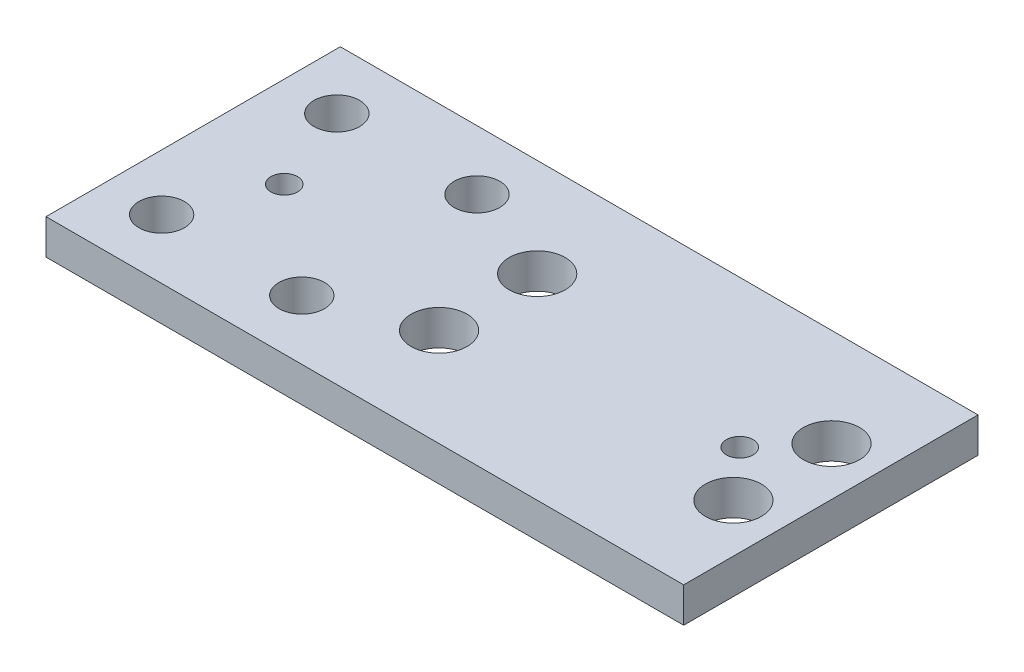
ISO-10303-21;
HEADER;
FILE_DESCRIPTION(('STEP AP214'),'2;1');
FILE_NAME('part.step','',(''),(''),'','','');
FILE_SCHEMA(('AUTOMOTIVE_DESIGN { 1 0 10303 214 1 1 1 1 }'));
ENDSEC;
DATA;
#1=APPLICATION_CONTEXT('core data for automotive mechanical design processes');
#2=APPLICATION_PROTOCOL_DEFINITION('international standard','automotive_design',2000,#1);
#3=PRODUCT_CONTEXT('',#1,'mechanical');
#4=PRODUCT('Part','Part','',(#3));
#5=PRODUCT_RELATED_PRODUCT_CATEGORY('part','',(#4));
#6=PRODUCT_DEFINITION_FORMATION('','',#4);
#7=PRODUCT_DEFINITION_CONTEXT('part definition',#1,'design');
#8=PRODUCT_DEFINITION('design','',#6,#7);
#9=PRODUCT_DEFINITION_SHAPE('','',#8);
#10=(LENGTH_UNIT() NAMED_UNIT(*) SI_UNIT(.MILLI.,.METRE.));
#11=(NAMED_UNIT(*) PLANE_ANGLE_UNIT() SI_UNIT($,.RADIAN.));
#12=(NAMED_UNIT(*) SI_UNIT($,.STERADIAN.) SOLID_ANGLE_UNIT());
#13=UNCERTAINTY_MEASURE_WITH_UNIT(LENGTH_MEASURE(1.E-05),#10,'distance_accuracy_value','');
#14=(GEOMETRIC_REPRESENTATION_CONTEXT(3) GLOBAL_UNCERTAINTY_ASSIGNED_CONTEXT((#13)) GLOBAL_UNIT_ASSIGNED_CONTEXT((#10,
#11,#12)) REPRESENTATION_CONTEXT('',''));
#15=CARTESIAN_POINT('',(0.,0.,0.));
#16=DIRECTION('',(0.,0.,1.));
#17=DIRECTION('',(1.,0.,0.));
#18=AXIS2_PLACEMENT_3D('',#15,#16,#17);
#19=CARTESIAN_POINT('',(0.,5.,0.));
#20=DIRECTION('',(1.,0.,0.));
#21=DIRECTION('',(0.,0.,-1.));
#22=AXIS2_PLACEMENT_3D('',#19,#20,#21);
#23=PLANE('',#22);
#24=DIRECTION('',(0.,0.,1.));
#25=VECTOR('',#24,1.);
#26=CARTESIAN_POINT('',(0.,0.,0.));
#27=LINE('',#26,#25);
#28=CARTESIAN_POINT('',(0.,0.,-42.));
#29=VERTEX_POINT('',#28);
#30=CARTESIAN_POINT('',(0.,0.,0.));
#31=VERTEX_POINT('',#30);
#32=EDGE_CURVE('E97',#29,#31,#27,.T.);
#33=ORIENTED_EDGE('',*,*,#32,.T.);
#34=DIRECTION('',(0.,-1.,0.));
#35=VECTOR('',#34,1.);
#36=CARTESIAN_POINT('',(0.,5.,0.));
#37=LINE('',#36,#35);
#38=CARTESIAN_POINT('',(0.,5.,0.));
#39=VERTEX_POINT('',#38);
#40=EDGE_CURVE('E11',#39,#31,#37,.T.);
#41=ORIENTED_EDGE('',*,*,#40,.F.);
#42=DIRECTION('',(0.,0.,1.));
#43=VECTOR('',#42,1.);
#44=CARTESIAN_POINT('',(0.,5.,0.));
#45=LINE('',#44,#43);
#46=CARTESIAN_POINT('',(0.,5.,-42.));
#47=VERTEX_POINT('',#46);
#48=EDGE_CURVE('E85',#47,#39,#45,.T.);
#49=ORIENTED_EDGE('',*,*,#48,.F.);
#50=DIRECTION('',(0.,-1.,0.));
#51=VECTOR('',#50,1.);
#52=CARTESIAN_POINT('',(0.,5.,-42.));
#53=LINE('',#52,#51);
#54=EDGE_CURVE('E93',#47,#29,#53,.T.);
#55=ORIENTED_EDGE('',*,*,#54,.T.);
#56=EDGE_LOOP('',(#33,#41,#49,#55));
#57=FACE_BOUND('',#56,.T.);
#58=ADVANCED_FACE('F34',(#57),#23,.F.);
#59=CARTESIAN_POINT('',(0.,5.,0.));
#60=DIRECTION('',(0.,0.,-1.));
#61=DIRECTION('',(-1.,0.,0.));
#62=AXIS2_PLACEMENT_3D('',#59,#60,#61);
#63=PLANE('',#62);
#64=DIRECTION('',(1.,0.,0.));
#65=VECTOR('',#64,1.);
#66=CARTESIAN_POINT('',(0.,0.,0.));
#67=LINE('',#66,#65);
#68=CARTESIAN_POINT('',(91.,0.,0.));
#69=VERTEX_POINT('',#68);
#70=EDGE_CURVE('E89',#31,#69,#67,.T.);
#71=ORIENTED_EDGE('',*,*,#70,.T.);
#72=DIRECTION('',(0.,-1.,0.));
#73=VECTOR('',#72,1.);
#74=CARTESIAN_POINT('',(91.,5.,0.));
#75=LINE('',#74,#73);
#76=CARTESIAN_POINT('',(91.,5.,0.));
#77=VERTEX_POINT('',#76);
#78=EDGE_CURVE('E42',#77,#69,#75,.T.);
#79=ORIENTED_EDGE('',*,*,#78,.F.);
#80=DIRECTION('',(1.,0.,0.));
#81=VECTOR('',#80,1.);
#82=CARTESIAN_POINT('',(0.,5.,0.));
#83=LINE('',#82,#81);
#84=EDGE_CURVE('E80',#39,#77,#83,.T.);
#85=ORIENTED_EDGE('',*,*,#84,.F.);
#86=ORIENTED_EDGE('',*,*,#40,.T.);
#87=EDGE_LOOP('',(#71,#79,#85,#86));
#88=FACE_BOUND('',#87,.T.);
#89=ADVANCED_FACE('F88',(#88),#63,.F.);
#90=CARTESIAN_POINT('',(91.,5.,0.));
#91=DIRECTION('',(-1.,0.,0.));
#92=DIRECTION('',(0.,0.,1.));
#93=AXIS2_PLACEMENT_3D('',#90,#91,#92);
#94=PLANE('',#93);
#95=DIRECTION('',(0.,0.,-1.));
#96=VECTOR('',#95,1.);
#97=CARTESIAN_POINT('',(91.,0.,0.));
#98=LINE('',#97,#96);
#99=CARTESIAN_POINT('',(91.,0.,-42.));
#100=VERTEX_POINT('',#99);
#101=EDGE_CURVE('E67',#69,#100,#98,.T.);
#102=ORIENTED_EDGE('',*,*,#101,.T.);
#103=DIRECTION('',(0.,-1.,0.));
#104=VECTOR('',#103,1.);
#105=CARTESIAN_POINT('',(91.,5.,-42.));
#106=LINE('',#105,#104);
#107=CARTESIAN_POINT('',(91.,5.,-42.));
#108=VERTEX_POINT('',#107);
#109=EDGE_CURVE('E90',#108,#100,#106,.T.);
#110=ORIENTED_EDGE('',*,*,#109,.F.);
#111=DIRECTION('',(0.,0.,-1.));
#112=VECTOR('',#111,1.);
#113=CARTESIAN_POINT('',(91.,5.,0.));
#114=LINE('',#113,#112);
#115=EDGE_CURVE('E83',#77,#108,#114,.T.);
#116=ORIENTED_EDGE('',*,*,#115,.F.);
#117=ORIENTED_EDGE('',*,*,#78,.T.);
#118=EDGE_LOOP('',(#102,#110,#116,#117));
#119=FACE_BOUND('',#118,.T.);
#120=ADVANCED_FACE('F91',(#119),#94,.F.);
#121=CARTESIAN_POINT('',(0.,5.,-42.));
#122=DIRECTION('',(0.,0.,1.));
#123=DIRECTION('',(1.,0.,0.));
#124=AXIS2_PLACEMENT_3D('',#121,#122,#123);
#125=PLANE('',#124);
#126=DIRECTION('',(-1.,0.,0.));
#127=VECTOR('',#126,1.);
#128=CARTESIAN_POINT('',(0.,0.,-42.));
#129=LINE('',#128,#127);
#130=EDGE_CURVE('E73',#100,#29,#129,.T.);
#131=ORIENTED_EDGE('',*,*,#130,.T.);
#132=ORIENTED_EDGE('',*,*,#54,.F.);
#133=DIRECTION('',(-1.,0.,0.));
#134=VECTOR('',#133,1.);
#135=CARTESIAN_POINT('',(0.,5.,-42.));
#136=LINE('',#135,#134);
#137=EDGE_CURVE('E50',#108,#47,#136,.T.);
#138=ORIENTED_EDGE('',*,*,#137,.F.);
#139=ORIENTED_EDGE('',*,*,#109,.T.);
#140=EDGE_LOOP('',(#131,#132,#138,#139));
#141=FACE_BOUND('',#140,.T.);
#142=ADVANCED_FACE('F105',(#141),#125,.F.);
#143=CARTESIAN_POINT('',(0.,5.,0.));
#144=DIRECTION('',(0.,-1.,0.));
#145=DIRECTION('',(0.,0.,-1.));
#146=AXIS2_PLACEMENT_3D('',#143,#144,#145);
#147=PLANE('',#146);
#148=CARTESIAN_POINT('',(8.,5.,-33.5));
#149=DIRECTION('',(0.,1.,0.));
#150=DIRECTION('',(0.,0.,1.));
#151=AXIS2_PLACEMENT_3D('',#148,#149,#150);
#152=CIRCLE('',#151,3.25);
#153=CARTESIAN_POINT('',(8.,5.,-30.25));
#154=VERTEX_POINT('',#153);
#155=EDGE_CURVE('E165',#154,#154,#152,.T.);
#156=ORIENTED_EDGE('',*,*,#155,.F.);
#157=EDGE_LOOP('',(#156));
#158=FACE_BOUND('',#157,.T.);
#159=CARTESIAN_POINT('',(8.,5.,-8.5));
#160=DIRECTION('',(0.,1.,0.));
#161=DIRECTION('',(0.,0.,1.));
#162=AXIS2_PLACEMENT_3D('',#159,#160,#161);
#163=CIRCLE('',#162,3.25);
#164=CARTESIAN_POINT('',(8.,5.,-5.25));
#165=VERTEX_POINT('',#164);
#166=EDGE_CURVE('E159',#165,#165,#163,.T.);
#167=ORIENTED_EDGE('',*,*,#166,.F.);
#168=EDGE_LOOP('',(#167));
#169=FACE_BOUND('',#168,.T.);
#170=CARTESIAN_POINT('',(28.,5.,-8.5));
#171=DIRECTION('',(0.,1.,0.));
#172=DIRECTION('',(0.,0.,1.));
#173=AXIS2_PLACEMENT_3D('',#170,#171,#172);
#174=CIRCLE('',#173,3.25);
#175=CARTESIAN_POINT('',(28.,5.,-5.25));
#176=VERTEX_POINT('',#175);
#177=EDGE_CURVE('E153',#176,#176,#174,.T.);
#178=ORIENTED_EDGE('',*,*,#177,.F.);
#179=EDGE_LOOP('',(#178));
#180=FACE_BOUND('',#179,.T.);
#181=CARTESIAN_POINT('',(28.,5.,-33.5));
#182=DIRECTION('',(0.,1.,0.));
#183=DIRECTION('',(0.,0.,1.));
#184=AXIS2_PLACEMENT_3D('',#181,#182,#183);
#185=CIRCLE('',#184,3.25);
#186=CARTESIAN_POINT('',(28.,5.,-30.25));
#187=VERTEX_POINT('',#186);
#188=EDGE_CURVE('E147',#187,#187,#185,.T.);
#189=ORIENTED_EDGE('',*,*,#188,.F.);
#190=EDGE_LOOP('',(#189));
#191=FACE_BOUND('',#190,.T.);
#192=CARTESIAN_POINT('',(42.0948730147645,5.,-28.));
#193=DIRECTION('',(0.,1.,0.));
#194=DIRECTION('',(0.,0.,1.));
#195=AXIS2_PLACEMENT_3D('',#192,#193,#194);
#196=CIRCLE('',#195,4.);
#197=CARTESIAN_POINT('',(42.0948730147645,5.,-24.));
#198=VERTEX_POINT('',#197);
#199=EDGE_CURVE('E141',#198,#198,#196,.T.);
#200=ORIENTED_EDGE('',*,*,#199,.F.);
#201=EDGE_LOOP('',(#200));
#202=FACE_BOUND('',#201,.T.);
#203=CARTESIAN_POINT('',(42.0948730147645,5.,-14.));
#204=DIRECTION('',(0.,1.,0.));
#205=DIRECTION('',(0.,0.,1.));
#206=AXIS2_PLACEMENT_3D('',#203,#204,#205);
#207=CIRCLE('',#206,4.00000000000001);
#208=CARTESIAN_POINT('',(42.0948730147645,5.,-9.99999999999999));
#209=VERTEX_POINT('',#208);
#210=EDGE_CURVE('E135',#209,#209,#207,.T.);
#211=ORIENTED_EDGE('',*,*,#210,.F.);
#212=EDGE_LOOP('',(#211));
#213=FACE_BOUND('',#212,.T.);
#214=CARTESIAN_POINT('',(84.0948730147645,5.,-14.));
#215=DIRECTION('',(0.,1.,0.));
#216=DIRECTION('',(0.,0.,1.));
#217=AXIS2_PLACEMENT_3D('',#214,#215,#216);
#218=CIRCLE('',#217,4.00000000000001);
#219=CARTESIAN_POINT('',(84.0948730147645,5.,-9.99999999999999));
#220=VERTEX_POINT('',#219);
#221=EDGE_CURVE('E129',#220,#220,#218,.T.);
#222=ORIENTED_EDGE('',*,*,#221,.F.);
#223=EDGE_LOOP('',(#222));
#224=FACE_BOUND('',#223,.T.);
#225=CARTESIAN_POINT('',(84.0948730147645,5.,-28.));
#226=DIRECTION('',(0.,1.,0.));
#227=DIRECTION('',(0.,0.,1.));
#228=AXIS2_PLACEMENT_3D('',#225,#226,#227);
#229=CIRCLE('',#228,4.00000000000001);
#230=CARTESIAN_POINT('',(84.0948730147645,5.,-24.));
#231=VERTEX_POINT('',#230);
#232=EDGE_CURVE('E123',#231,#231,#229,.T.);
#233=ORIENTED_EDGE('',*,*,#232,.F.);
#234=EDGE_LOOP('',(#233));
#235=FACE_BOUND('',#234,.T.);
#236=CARTESIAN_POINT('',(13.,5.,-21.));
#237=DIRECTION('',(0.,1.,0.));
#238=DIRECTION('',(0.,0.,1.));
#239=AXIS2_PLACEMENT_3D('',#236,#237,#238);
#240=CIRCLE('',#239,1.9);
#241=CARTESIAN_POINT('',(13.,5.,-19.1));
#242=VERTEX_POINT('',#241);
#243=EDGE_CURVE('E117',#242,#242,#240,.T.);
#244=ORIENTED_EDGE('',*,*,#243,.F.);
#245=EDGE_LOOP('',(#244));
#246=FACE_BOUND('',#245,.T.);
#247=CARTESIAN_POINT('',(78.,5.,-21.));
#248=DIRECTION('',(0.,1.,0.));
#249=DIRECTION('',(0.,0.,1.));
#250=AXIS2_PLACEMENT_3D('',#247,#248,#249);
#251=CIRCLE('',#250,1.9);
#252=CARTESIAN_POINT('',(78.,5.,-19.1));
#253=VERTEX_POINT('',#252);
#254=EDGE_CURVE('E111',#253,#253,#251,.T.);
#255=ORIENTED_EDGE('',*,*,#254,.F.);
#256=EDGE_LOOP('',(#255));
#257=FACE_BOUND('',#256,.T.);
#258=ORIENTED_EDGE('',*,*,#48,.T.);
#259=ORIENTED_EDGE('',*,*,#84,.T.);
#260=ORIENTED_EDGE('',*,*,#115,.T.);
#261=ORIENTED_EDGE('',*,*,#137,.T.);
#262=EDGE_LOOP('',(#258,#259,#260,#261));
#263=FACE_BOUND('',#262,.T.);
#264=ADVANCED_FACE('F81',(#158,#169,#180,#191,#202,#213,#224,#235,#246,#257,#263),#147,.F.);
#265=CARTESIAN_POINT('',(0.,0.,0.));
#266=DIRECTION('',(0.,-1.,0.));
#267=DIRECTION('',(0.,0.,-1.));
#268=AXIS2_PLACEMENT_3D('',#265,#266,#267);
#269=PLANE('',#268);
#270=CARTESIAN_POINT('',(8.,0.,-33.5));
#271=DIRECTION('',(0.,1.,0.));
#272=DIRECTION('',(0.,0.,1.));
#273=AXIS2_PLACEMENT_3D('',#270,#271,#272);
#274=CIRCLE('',#273,3.25);
#275=CARTESIAN_POINT('',(8.,0.,-30.25));
#276=VERTEX_POINT('',#275);
#277=EDGE_CURVE('E162',#276,#276,#274,.T.);
#278=ORIENTED_EDGE('',*,*,#277,.T.);
#279=EDGE_LOOP('',(#278));
#280=FACE_BOUND('',#279,.T.);
#281=CARTESIAN_POINT('',(8.,0.,-8.5));
#282=DIRECTION('',(0.,1.,0.));
#283=DIRECTION('',(0.,0.,1.));
#284=AXIS2_PLACEMENT_3D('',#281,#282,#283);
#285=CIRCLE('',#284,3.25);
#286=CARTESIAN_POINT('',(8.,0.,-5.25));
#287=VERTEX_POINT('',#286);
#288=EDGE_CURVE('E156',#287,#287,#285,.T.);
#289=ORIENTED_EDGE('',*,*,#288,.T.);
#290=EDGE_LOOP('',(#289));
#291=FACE_BOUND('',#290,.T.);
#292=CARTESIAN_POINT('',(28.,0.,-8.5));
#293=DIRECTION('',(0.,1.,0.));
#294=DIRECTION('',(0.,0.,1.));
#295=AXIS2_PLACEMENT_3D('',#292,#293,#294);
#296=CIRCLE('',#295,3.25);
#297=CARTESIAN_POINT('',(28.,0.,-5.25));
#298=VERTEX_POINT('',#297);
#299=EDGE_CURVE('E150',#298,#298,#296,.T.);
#300=ORIENTED_EDGE('',*,*,#299,.T.);
#301=EDGE_LOOP('',(#300));
#302=FACE_BOUND('',#301,.T.);
#303=CARTESIAN_POINT('',(28.,0.,-33.5));
#304=DIRECTION('',(0.,1.,0.));
#305=DIRECTION('',(0.,0.,1.));
#306=AXIS2_PLACEMENT_3D('',#303,#304,#305);
#307=CIRCLE('',#306,3.25);
#308=CARTESIAN_POINT('',(28.,0.,-30.25));
#309=VERTEX_POINT('',#308);
#310=EDGE_CURVE('E144',#309,#309,#307,.T.);
#311=ORIENTED_EDGE('',*,*,#310,.T.);
#312=EDGE_LOOP('',(#311));
#313=FACE_BOUND('',#312,.T.);
#314=CARTESIAN_POINT('',(42.0948730147645,0.,-28.));
#315=DIRECTION('',(0.,1.,0.));
#316=DIRECTION('',(0.,0.,1.));
#317=AXIS2_PLACEMENT_3D('',#314,#315,#316);
#318=CIRCLE('',#317,4.);
#319=CARTESIAN_POINT('',(42.0948730147645,0.,-24.));
#320=VERTEX_POINT('',#319);
#321=EDGE_CURVE('E138',#320,#320,#318,.T.);
#322=ORIENTED_EDGE('',*,*,#321,.T.);
#323=EDGE_LOOP('',(#322));
#324=FACE_BOUND('',#323,.T.);
#325=CARTESIAN_POINT('',(42.0948730147645,0.,-14.));
#326=DIRECTION('',(0.,1.,0.));
#327=DIRECTION('',(0.,0.,1.));
#328=AXIS2_PLACEMENT_3D('',#325,#326,#327);
#329=CIRCLE('',#328,4.00000000000001);
#330=CARTESIAN_POINT('',(42.0948730147645,0.,-9.99999999999999));
#331=VERTEX_POINT('',#330);
#332=EDGE_CURVE('E132',#331,#331,#329,.T.);
#333=ORIENTED_EDGE('',*,*,#332,.T.);
#334=EDGE_LOOP('',(#333));
#335=FACE_BOUND('',#334,.T.);
#336=CARTESIAN_POINT('',(84.0948730147645,0.,-14.));
#337=DIRECTION('',(0.,1.,0.));
#338=DIRECTION('',(0.,0.,1.));
#339=AXIS2_PLACEMENT_3D('',#336,#337,#338);
#340=CIRCLE('',#339,4.00000000000001);
#341=CARTESIAN_POINT('',(84.0948730147645,0.,-9.99999999999999));
#342=VERTEX_POINT('',#341);
#343=EDGE_CURVE('E126',#342,#342,#340,.T.);
#344=ORIENTED_EDGE('',*,*,#343,.T.);
#345=EDGE_LOOP('',(#344));
#346=FACE_BOUND('',#345,.T.);
#347=CARTESIAN_POINT('',(84.0948730147645,0.,-28.));
#348=DIRECTION('',(0.,1.,0.));
#349=DIRECTION('',(0.,0.,1.));
#350=AXIS2_PLACEMENT_3D('',#347,#348,#349);
#351=CIRCLE('',#350,4.00000000000001);
#352=CARTESIAN_POINT('',(84.0948730147645,0.,-24.));
#353=VERTEX_POINT('',#352);
#354=EDGE_CURVE('E120',#353,#353,#351,.T.);
#355=ORIENTED_EDGE('',*,*,#354,.T.);
#356=EDGE_LOOP('',(#355));
#357=FACE_BOUND('',#356,.T.);
#358=CARTESIAN_POINT('',(13.,0.,-21.));
#359=DIRECTION('',(0.,1.,0.));
#360=DIRECTION('',(0.,0.,1.));
#361=AXIS2_PLACEMENT_3D('',#358,#359,#360);
#362=CIRCLE('',#361,1.9);
#363=CARTESIAN_POINT('',(13.,0.,-19.1));
#364=VERTEX_POINT('',#363);
#365=EDGE_CURVE('E114',#364,#364,#362,.T.);
#366=ORIENTED_EDGE('',*,*,#365,.T.);
#367=EDGE_LOOP('',(#366));
#368=FACE_BOUND('',#367,.T.);
#369=CARTESIAN_POINT('',(78.,0.,-21.));
#370=DIRECTION('',(0.,1.,0.));
#371=DIRECTION('',(0.,0.,1.));
#372=AXIS2_PLACEMENT_3D('',#369,#370,#371);
#373=CIRCLE('',#372,1.9);
#374=CARTESIAN_POINT('',(78.,0.,-19.1));
#375=VERTEX_POINT('',#374);
#376=EDGE_CURVE('E100',#375,#375,#373,.T.);
#377=ORIENTED_EDGE('',*,*,#376,.T.);
#378=EDGE_LOOP('',(#377));
#379=FACE_BOUND('',#378,.T.);
#380=ORIENTED_EDGE('',*,*,#32,.F.);
#381=ORIENTED_EDGE('',*,*,#130,.F.);
#382=ORIENTED_EDGE('',*,*,#101,.F.);
#383=ORIENTED_EDGE('',*,*,#70,.F.);
#384=EDGE_LOOP('',(#380,#381,#382,#383));
#385=FACE_BOUND('',#384,.T.);
#386=ADVANCED_FACE('F108',(#280,#291,#302,#313,#324,#335,#346,#357,#368,#379,#385),#269,.T.);
#387=CARTESIAN_POINT('',(78.,0.,-21.));
#388=DIRECTION('',(0.,1.,0.));
#389=DIRECTION('',(0.,0.,1.));
#390=AXIS2_PLACEMENT_3D('',#387,#388,#389);
#391=CYLINDRICAL_SURFACE('',#390,1.9);
#392=ORIENTED_EDGE('',*,*,#376,.F.);
#393=EDGE_LOOP('',(#392));
#394=FACE_BOUND('',#393,.T.);
#395=ORIENTED_EDGE('',*,*,#254,.T.);
#396=EDGE_LOOP('',(#395));
#397=FACE_BOUND('',#396,.T.);
#398=ADVANCED_FACE('F201',(#394,#397),#391,.F.);
#399=CARTESIAN_POINT('',(13.,0.,-21.));
#400=DIRECTION('',(0.,1.,0.));
#401=DIRECTION('',(0.,0.,1.));
#402=AXIS2_PLACEMENT_3D('',#399,#400,#401);
#403=CYLINDRICAL_SURFACE('',#402,1.9);
#404=ORIENTED_EDGE('',*,*,#365,.F.);
#405=EDGE_LOOP('',(#404));
#406=FACE_BOUND('',#405,.T.);
#407=ORIENTED_EDGE('',*,*,#243,.T.);
#408=EDGE_LOOP('',(#407));
#409=FACE_BOUND('',#408,.T.);
#410=ADVANCED_FACE('F203',(#406,#409),#403,.F.);
#411=CARTESIAN_POINT('',(84.0948730147645,0.,-28.));
#412=DIRECTION('',(0.,1.,0.));
#413=DIRECTION('',(0.,0.,1.));
#414=AXIS2_PLACEMENT_3D('',#411,#412,#413);
#415=CYLINDRICAL_SURFACE('',#414,4.00000000000001);
#416=ORIENTED_EDGE('',*,*,#354,.F.);
#417=EDGE_LOOP('',(#416));
#418=FACE_BOUND('',#417,.T.);
#419=ORIENTED_EDGE('',*,*,#232,.T.);
#420=EDGE_LOOP('',(#419));
#421=FACE_BOUND('',#420,.T.);
#422=ADVANCED_FACE('F210',(#418,#421),#415,.F.);
#423=CARTESIAN_POINT('',(84.0948730147645,0.,-14.));
#424=DIRECTION('',(0.,1.,0.));
#425=DIRECTION('',(0.,0.,1.));
#426=AXIS2_PLACEMENT_3D('',#423,#424,#425);
#427=CYLINDRICAL_SURFACE('',#426,4.00000000000001);
#428=ORIENTED_EDGE('',*,*,#343,.F.);
#429=EDGE_LOOP('',(#428));
#430=FACE_BOUND('',#429,.T.);
#431=ORIENTED_EDGE('',*,*,#221,.T.);
#432=EDGE_LOOP('',(#431));
#433=FACE_BOUND('',#432,.T.);
#434=ADVANCED_FACE('F248',(#430,#433),#427,.F.);
#435=CARTESIAN_POINT('',(42.0948730147645,0.,-14.));
#436=DIRECTION('',(0.,1.,0.));
#437=DIRECTION('',(0.,0.,1.));
#438=AXIS2_PLACEMENT_3D('',#435,#436,#437);
#439=CYLINDRICAL_SURFACE('',#438,4.00000000000001);
#440=ORIENTED_EDGE('',*,*,#332,.F.);
#441=EDGE_LOOP('',(#440));
#442=FACE_BOUND('',#441,.T.);
#443=ORIENTED_EDGE('',*,*,#210,.T.);
#444=EDGE_LOOP('',(#443));
#445=FACE_BOUND('',#444,.T.);
#446=ADVANCED_FACE('F259',(#442,#445),#439,.F.);
#447=CARTESIAN_POINT('',(42.0948730147645,0.,-28.));
#448=DIRECTION('',(0.,1.,0.));
#449=DIRECTION('',(0.,0.,1.));
#450=AXIS2_PLACEMENT_3D('',#447,#448,#449);
#451=CYLINDRICAL_SURFACE('',#450,4.);
#452=ORIENTED_EDGE('',*,*,#321,.F.);
#453=EDGE_LOOP('',(#452));
#454=FACE_BOUND('',#453,.T.);
#455=ORIENTED_EDGE('',*,*,#199,.T.);
#456=EDGE_LOOP('',(#455));
#457=FACE_BOUND('',#456,.T.);
#458=ADVANCED_FACE('F269',(#454,#457),#451,.F.);
#459=CARTESIAN_POINT('',(28.,0.,-33.5));
#460=DIRECTION('',(0.,1.,0.));
#461=DIRECTION('',(0.,0.,1.));
#462=AXIS2_PLACEMENT_3D('',#459,#460,#461);
#463=CYLINDRICAL_SURFACE('',#462,3.25);
#464=ORIENTED_EDGE('',*,*,#310,.F.);
#465=EDGE_LOOP('',(#464));
#466=FACE_BOUND('',#465,.T.);
#467=ORIENTED_EDGE('',*,*,#188,.T.);
#468=EDGE_LOOP('',(#467));
#469=FACE_BOUND('',#468,.T.);
#470=ADVANCED_FACE('F279',(#466,#469),#463,.F.);
#471=CARTESIAN_POINT('',(28.,0.,-8.5));
#472=DIRECTION('',(0.,1.,0.));
#473=DIRECTION('',(0.,0.,1.));
#474=AXIS2_PLACEMENT_3D('',#471,#472,#473);
#475=CYLINDRICAL_SURFACE('',#474,3.25);
#476=ORIENTED_EDGE('',*,*,#299,.F.);
#477=EDGE_LOOP('',(#476));
#478=FACE_BOUND('',#477,.T.);
#479=ORIENTED_EDGE('',*,*,#177,.T.);
#480=EDGE_LOOP('',(#479));
#481=FACE_BOUND('',#480,.T.);
#482=ADVANCED_FACE('F289',(#478,#481),#475,.F.);
#483=CARTESIAN_POINT('',(8.,0.,-8.5));
#484=DIRECTION('',(0.,1.,0.));
#485=DIRECTION('',(0.,0.,1.));
#486=AXIS2_PLACEMENT_3D('',#483,#484,#485);
#487=CYLINDRICAL_SURFACE('',#486,3.25);
#488=ORIENTED_EDGE('',*,*,#288,.F.);
#489=EDGE_LOOP('',(#488));
#490=FACE_BOUND('',#489,.T.);
#491=ORIENTED_EDGE('',*,*,#166,.T.);
#492=EDGE_LOOP('',(#491));
#493=FACE_BOUND('',#492,.T.);
#494=ADVANCED_FACE('F176',(#490,#493),#487,.F.);
#495=CARTESIAN_POINT('',(8.,0.,-33.5));
#496=DIRECTION('',(0.,1.,0.));
#497=DIRECTION('',(0.,0.,1.));
#498=AXIS2_PLACEMENT_3D('',#495,#496,#497);
#499=CYLINDRICAL_SURFACE('',#498,3.25);
#500=ORIENTED_EDGE('',*,*,#277,.F.);
#501=EDGE_LOOP('',(#500));
#502=FACE_BOUND('',#501,.T.);
#503=ORIENTED_EDGE('',*,*,#155,.T.);
#504=EDGE_LOOP('',(#503));
#505=FACE_BOUND('',#504,.T.);
#506=ADVANCED_FACE('F173',(#502,#505),#499,.F.);
#507=CLOSED_SHELL('',(#58,#89,#120,#142,#264,#386,#398,#410,#422,#434,#446,#458,#470,#482,#494,#506));
#508=MANIFOLD_SOLID_BREP('B2',#507);
#509=ADVANCED_BREP_SHAPE_REPRESENTATION('',(#18,#508),#14);
#510=SHAPE_DEFINITION_REPRESENTATION(#9,#509);
ENDSEC;
END-ISO-10303-21;
